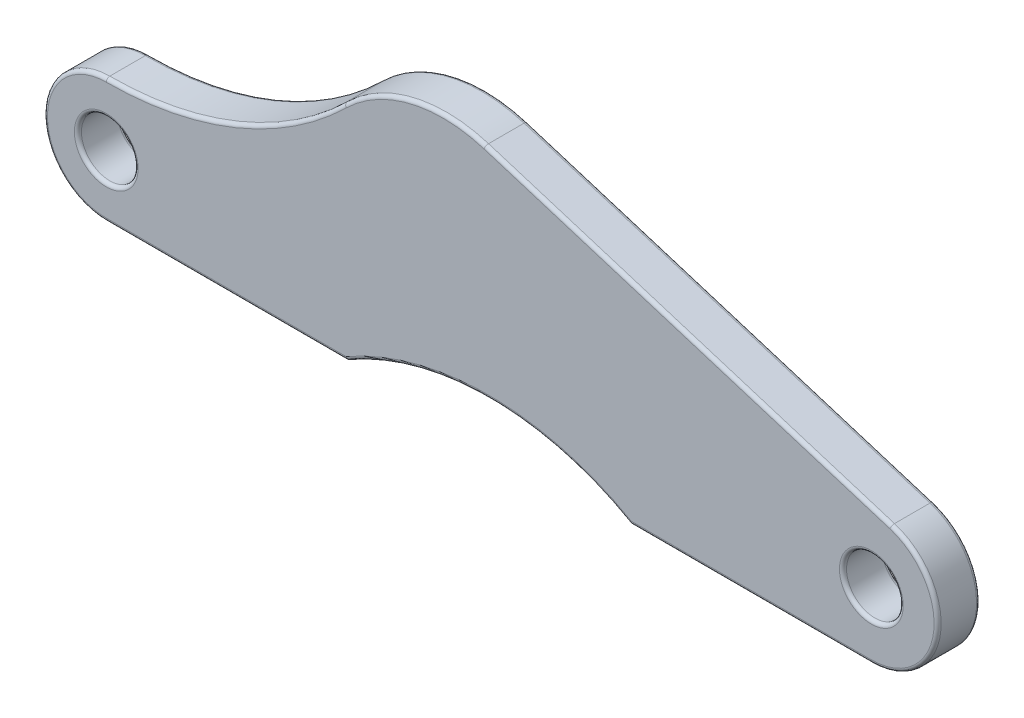
ISO-10303-21;
HEADER;
FILE_DESCRIPTION(('STEP AP214'),'2;1');
FILE_NAME('part.step','',(''),(''),'','','');
FILE_SCHEMA(('AUTOMOTIVE_DESIGN { 1 0 10303 214 1 1 1 1 }'));
ENDSEC;
DATA;
#1=APPLICATION_CONTEXT('core data for automotive mechanical design processes');
#2=APPLICATION_PROTOCOL_DEFINITION('international standard','automotive_design',2000,#1);
#3=PRODUCT_CONTEXT('',#1,'mechanical');
#4=PRODUCT('Part','Part','',(#3));
#5=PRODUCT_RELATED_PRODUCT_CATEGORY('part','',(#4));
#6=PRODUCT_DEFINITION_FORMATION('','',#4);
#7=PRODUCT_DEFINITION_CONTEXT('part definition',#1,'design');
#8=PRODUCT_DEFINITION('design','',#6,#7);
#9=PRODUCT_DEFINITION_SHAPE('','',#8);
#10=(LENGTH_UNIT() NAMED_UNIT(*) SI_UNIT(.MILLI.,.METRE.));
#11=(NAMED_UNIT(*) PLANE_ANGLE_UNIT() SI_UNIT($,.RADIAN.));
#12=(NAMED_UNIT(*) SI_UNIT($,.STERADIAN.) SOLID_ANGLE_UNIT());
#13=UNCERTAINTY_MEASURE_WITH_UNIT(LENGTH_MEASURE(1.E-05),#10,'distance_accuracy_value','');
#14=(GEOMETRIC_REPRESENTATION_CONTEXT(3) GLOBAL_UNCERTAINTY_ASSIGNED_CONTEXT((#13)) GLOBAL_UNIT_ASSIGNED_CONTEXT((#10,
#11,#12)) REPRESENTATION_CONTEXT('',''));
#15=CARTESIAN_POINT('',(0.,0.,0.));
#16=DIRECTION('',(0.,0.,1.));
#17=DIRECTION('',(1.,0.,0.));
#18=AXIS2_PLACEMENT_3D('',#15,#16,#17);
#19=CARTESIAN_POINT('',(-27.,4.4,1.5));
#20=DIRECTION('',(0.,0.,-1.));
#21=DIRECTION('',(-1.,0.,0.));
#22=AXIS2_PLACEMENT_3D('',#19,#20,#21);
#23=PLANE('',#22);
#24=CARTESIAN_POINT('',(27.,4.67759357368477,1.5));
#25=DIRECTION('',(0.,0.,-1.));
#26=DIRECTION('',(-1.,0.,0.));
#27=AXIS2_PLACEMENT_3D('',#24,#25,#26);
#28=CIRCLE('',#27,2.25);
#29=CARTESIAN_POINT('',(24.75,4.67759357368477,1.5));
#30=VERTEX_POINT('',#29);
#31=EDGE_CURVE('E176',#30,#30,#28,.T.);
#32=ORIENTED_EDGE('',*,*,#31,.T.);
#33=EDGE_LOOP('',(#32));
#34=FACE_BOUND('',#33,.T.);
#35=CARTESIAN_POINT('',(-27.,4.4,1.5));
#36=DIRECTION('',(0.,0.,-1.));
#37=DIRECTION('',(-1.,0.,0.));
#38=AXIS2_PLACEMENT_3D('',#35,#36,#37);
#39=CIRCLE('',#38,2.25);
#40=CARTESIAN_POINT('',(-29.25,4.4,1.5));
#41=VERTEX_POINT('',#40);
#42=EDGE_CURVE('E173',#41,#41,#39,.T.);
#43=ORIENTED_EDGE('',*,*,#42,.T.);
#44=EDGE_LOOP('',(#43));
#45=FACE_BOUND('',#44,.T.);
#46=CARTESIAN_POINT('',(-3.22891311803524,8.49083653331356,1.5));
#47=DIRECTION('',(0.,0.,-1.));
#48=DIRECTION('',(-1.,0.,0.));
#49=AXIS2_PLACEMENT_3D('',#46,#47,#48);
#50=CIRCLE('',#49,9.75);
#51=CARTESIAN_POINT('',(-0.33763276202348,17.8022809917711,1.5));
#52=VERTEX_POINT('',#51);
#53=CARTESIAN_POINT('',(-10.0456218562457,15.4618466450839,1.5));
#54=VERTEX_POINT('',#53);
#55=EDGE_CURVE('E171',#52,#54,#50,.F.);
#56=ORIENTED_EDGE('',*,*,#55,.T.);
#57=CARTESIAN_POINT('',(-27.,32.8,1.5));
#58=DIRECTION('',(0.,0.,-1.));
#59=DIRECTION('',(-1.,0.,0.));
#60=AXIS2_PLACEMENT_3D('',#57,#58,#59);
#61=CIRCLE('',#60,24.25);
#62=CARTESIAN_POINT('',(-27.,8.55,1.5));
#63=VERTEX_POINT('',#62);
#64=EDGE_CURVE('E153',#54,#63,#61,.T.);
#65=ORIENTED_EDGE('',*,*,#64,.T.);
#66=CARTESIAN_POINT('',(-27.,4.4,1.5));
#67=DIRECTION('',(0.,0.,-1.));
#68=DIRECTION('',(-1.,0.,0.));
#69=AXIS2_PLACEMENT_3D('',#66,#67,#68);
#70=CIRCLE('',#69,4.15);
#71=CARTESIAN_POINT('',(-27.,0.250000000000001,1.5));
#72=VERTEX_POINT('',#71);
#73=EDGE_CURVE('E161',#63,#72,#70,.F.);
#74=ORIENTED_EDGE('',*,*,#73,.T.);
#75=DIRECTION('',(1.,0.,0.));
#76=VECTOR('',#75,1.);
#77=CARTESIAN_POINT('',(-27.,0.25,1.5));
#78=LINE('',#77,#76);
#79=CARTESIAN_POINT('',(-10.0667644236942,0.25,1.5));
#80=VERTEX_POINT('',#79);
#81=EDGE_CURVE('E167',#72,#80,#78,.T.);
#82=ORIENTED_EDGE('',*,*,#81,.T.);
#83=CARTESIAN_POINT('',(0.,-17.3205080756888,1.5));
#84=DIRECTION('',(0.,0.,-1.));
#85=DIRECTION('',(-1.,0.,0.));
#86=AXIS2_PLACEMENT_3D('',#83,#84,#85);
#87=CIRCLE('',#86,20.25);
#88=CARTESIAN_POINT('',(10.0667644236942,0.25,1.5));
#89=VERTEX_POINT('',#88);
#90=EDGE_CURVE('E456',#80,#89,#87,.T.);
#91=ORIENTED_EDGE('',*,*,#90,.T.);
#92=DIRECTION('',(1.,0.,0.));
#93=VECTOR('',#92,1.);
#94=CARTESIAN_POINT('',(-27.,0.25,1.5));
#95=LINE('',#94,#93);
#96=CARTESIAN_POINT('',(27.,0.25,1.5));
#97=VERTEX_POINT('',#96);
#98=EDGE_CURVE('E458',#89,#97,#95,.T.);
#99=ORIENTED_EDGE('',*,*,#98,.T.);
#100=CARTESIAN_POINT('',(27.,4.67759357368477,1.5));
#101=DIRECTION('',(0.,0.,-1.));
#102=DIRECTION('',(-1.,0.,0.));
#103=AXIS2_PLACEMENT_3D('',#100,#101,#102);
#104=CIRCLE('',#103,4.42759357368476);
#105=CARTESIAN_POINT('',(28.3129655716922,8.9060337425042,1.5));
#106=VERTEX_POINT('',#105);
#107=EDGE_CURVE('E427',#97,#106,#104,.F.);
#108=ORIENTED_EDGE('',*,*,#107,.T.);
#109=DIRECTION('',(-0.955019944457189,0.296541574975565,0.));
#110=VECTOR('',#109,1.);
#111=CARTESIAN_POINT('',(-20.8598261553698,24.1745914195654,1.5));
#112=LINE('',#111,#110);
#113=EDGE_CURVE('E178',#106,#52,#112,.T.);
#114=ORIENTED_EDGE('',*,*,#113,.T.);
#115=EDGE_LOOP('',(#56,#65,#74,#82,#91,#99,#108,#114));
#116=FACE_BOUND('',#115,.T.);
#117=ADVANCED_FACE('F33',(#34,#45,#116),#23,.F.);
#118=CARTESIAN_POINT('',(-27.,4.4,-1.5));
#119=DIRECTION('',(0.,0.,-1.));
#120=DIRECTION('',(-1.,0.,0.));
#121=AXIS2_PLACEMENT_3D('',#118,#119,#120);
#122=PLANE('',#121);
#123=CARTESIAN_POINT('',(27.,4.67759357368477,-1.5));
#124=DIRECTION('',(0.,0.,-1.));
#125=DIRECTION('',(-1.,0.,0.));
#126=AXIS2_PLACEMENT_3D('',#123,#124,#125);
#127=CIRCLE('',#126,2.25);
#128=CARTESIAN_POINT('',(24.75,4.67759357368477,-1.5));
#129=VERTEX_POINT('',#128);
#130=EDGE_CURVE('E11',#129,#129,#127,.F.);
#131=ORIENTED_EDGE('',*,*,#130,.T.);
#132=EDGE_LOOP('',(#131));
#133=FACE_BOUND('',#132,.T.);
#134=CARTESIAN_POINT('',(0.,-17.3205080756888,-1.5));
#135=DIRECTION('',(0.,0.,-1.));
#136=DIRECTION('',(-1.,0.,0.));
#137=AXIS2_PLACEMENT_3D('',#134,#135,#136);
#138=CIRCLE('',#137,20.25);
#139=CARTESIAN_POINT('',(10.0667644236942,0.25,-1.5));
#140=VERTEX_POINT('',#139);
#141=CARTESIAN_POINT('',(-10.0667644236942,0.25,-1.5));
#142=VERTEX_POINT('',#141);
#143=EDGE_CURVE('E50',#140,#142,#138,.F.);
#144=ORIENTED_EDGE('',*,*,#143,.T.);
#145=DIRECTION('',(1.,0.,0.));
#146=VECTOR('',#145,1.);
#147=CARTESIAN_POINT('',(-27.,0.25,-1.5));
#148=LINE('',#147,#146);
#149=CARTESIAN_POINT('',(-27.,0.250000000000001,-1.5));
#150=VERTEX_POINT('',#149);
#151=EDGE_CURVE('E42',#142,#150,#148,.F.);
#152=ORIENTED_EDGE('',*,*,#151,.T.);
#153=CARTESIAN_POINT('',(-27.,4.4,-1.5));
#154=DIRECTION('',(0.,0.,-1.));
#155=DIRECTION('',(-1.,0.,0.));
#156=AXIS2_PLACEMENT_3D('',#153,#154,#155);
#157=CIRCLE('',#156,4.15);
#158=CARTESIAN_POINT('',(-27.,8.55,-1.5));
#159=VERTEX_POINT('',#158);
#160=EDGE_CURVE('E225',#150,#159,#157,.T.);
#161=ORIENTED_EDGE('',*,*,#160,.T.);
#162=CARTESIAN_POINT('',(-27.,32.8,-1.5));
#163=DIRECTION('',(0.,0.,-1.));
#164=DIRECTION('',(-1.,0.,0.));
#165=AXIS2_PLACEMENT_3D('',#162,#163,#164);
#166=CIRCLE('',#165,24.25);
#167=CARTESIAN_POINT('',(-10.0456218562457,15.4618466450839,-1.5));
#168=VERTEX_POINT('',#167);
#169=EDGE_CURVE('E227',#159,#168,#166,.F.);
#170=ORIENTED_EDGE('',*,*,#169,.T.);
#171=CARTESIAN_POINT('',(-3.22891311803524,8.49083653331356,-1.5));
#172=DIRECTION('',(0.,0.,-1.));
#173=DIRECTION('',(-1.,0.,0.));
#174=AXIS2_PLACEMENT_3D('',#171,#172,#173);
#175=CIRCLE('',#174,9.75);
#176=CARTESIAN_POINT('',(-0.337632762023481,17.8022809917711,-1.5));
#177=VERTEX_POINT('',#176);
#178=EDGE_CURVE('E229',#168,#177,#175,.T.);
#179=ORIENTED_EDGE('',*,*,#178,.T.);
#180=DIRECTION('',(-0.955019944457189,0.296541574975565,0.));
#181=VECTOR('',#180,1.);
#182=CARTESIAN_POINT('',(28.3129655716922,8.90603374250419,-1.5));
#183=LINE('',#182,#181);
#184=CARTESIAN_POINT('',(28.3129655716922,8.90603374250419,-1.5));
#185=VERTEX_POINT('',#184);
#186=EDGE_CURVE('E231',#177,#185,#183,.F.);
#187=ORIENTED_EDGE('',*,*,#186,.T.);
#188=CARTESIAN_POINT('',(27.,4.67759357368477,-1.5));
#189=DIRECTION('',(0.,0.,-1.));
#190=DIRECTION('',(-1.,0.,0.));
#191=AXIS2_PLACEMENT_3D('',#188,#189,#190);
#192=CIRCLE('',#191,4.42759357368476);
#193=CARTESIAN_POINT('',(27.,0.250000000000004,-1.5));
#194=VERTEX_POINT('',#193);
#195=EDGE_CURVE('E233',#185,#194,#192,.T.);
#196=ORIENTED_EDGE('',*,*,#195,.T.);
#197=DIRECTION('',(1.,0.,0.));
#198=VECTOR('',#197,1.);
#199=CARTESIAN_POINT('',(9.99999999999999,0.25,-1.5));
#200=LINE('',#199,#198);
#201=EDGE_CURVE('E55',#194,#140,#200,.F.);
#202=ORIENTED_EDGE('',*,*,#201,.T.);
#203=EDGE_LOOP('',(#144,#152,#161,#170,#179,#187,#196,#202));
#204=FACE_BOUND('',#203,.T.);
#205=CARTESIAN_POINT('',(-27.,4.4,-1.5));
#206=DIRECTION('',(0.,0.,-1.));
#207=DIRECTION('',(-1.,0.,0.));
#208=AXIS2_PLACEMENT_3D('',#205,#206,#207);
#209=CIRCLE('',#208,2.25);
#210=CARTESIAN_POINT('',(-29.25,4.4,-1.5));
#211=VERTEX_POINT('',#210);
#212=EDGE_CURVE('E222',#211,#211,#209,.F.);
#213=ORIENTED_EDGE('',*,*,#212,.T.);
#214=EDGE_LOOP('',(#213));
#215=FACE_BOUND('',#214,.T.);
#216=ADVANCED_FACE('F341',(#133,#204,#215),#122,.T.);
#217=CARTESIAN_POINT('',(-27.,4.4,1.5));
#218=DIRECTION('',(0.,0.,-1.));
#219=DIRECTION('',(-1.,0.,0.));
#220=AXIS2_PLACEMENT_3D('',#217,#218,#219);
#221=CYLINDRICAL_SURFACE('',#220,4.4);
#222=DIRECTION('',(0.,0.,-1.));
#223=VECTOR('',#222,1.);
#224=CARTESIAN_POINT('',(-27.,0.,1.5));
#225=LINE('',#224,#223);
#226=CARTESIAN_POINT('',(-27.,0.,1.25));
#227=VERTEX_POINT('',#226);
#228=CARTESIAN_POINT('',(-27.,0.,-1.25));
#229=VERTEX_POINT('',#228);
#230=EDGE_CURVE('E447',#227,#229,#225,.T.);
#231=ORIENTED_EDGE('',*,*,#230,.F.);
#232=CARTESIAN_POINT('',(-27.,4.4,1.25));
#233=DIRECTION('',(0.,0.,-1.));
#234=DIRECTION('',(-1.,0.,0.));
#235=AXIS2_PLACEMENT_3D('',#232,#233,#234);
#236=CIRCLE('',#235,4.4);
#237=CARTESIAN_POINT('',(-27.,8.8,1.25));
#238=VERTEX_POINT('',#237);
#239=EDGE_CURVE('E220',#227,#238,#236,.T.);
#240=ORIENTED_EDGE('',*,*,#239,.T.);
#241=DIRECTION('',(0.,0.,-1.));
#242=VECTOR('',#241,1.);
#243=CARTESIAN_POINT('',(-27.,8.8,1.5));
#244=LINE('',#243,#242);
#245=CARTESIAN_POINT('',(-27.,8.8,-1.25));
#246=VERTEX_POINT('',#245);
#247=EDGE_CURVE('E430',#238,#246,#244,.T.);
#248=ORIENTED_EDGE('',*,*,#247,.T.);
#249=CARTESIAN_POINT('',(-27.,4.4,-1.25));
#250=DIRECTION('',(0.,0.,-1.));
#251=DIRECTION('',(-1.,0.,0.));
#252=AXIS2_PLACEMENT_3D('',#249,#250,#251);
#253=CIRCLE('',#252,4.4);
#254=EDGE_CURVE('E218',#246,#229,#253,.F.);
#255=ORIENTED_EDGE('',*,*,#254,.T.);
#256=EDGE_LOOP('',(#231,#240,#248,#255));
#257=FACE_BOUND('',#256,.T.);
#258=ADVANCED_FACE('F347',(#257),#221,.T.);
#259=CARTESIAN_POINT('',(-27.,0.,1.5));
#260=DIRECTION('',(0.,1.,0.));
#261=DIRECTION('',(0.,0.,1.));
#262=AXIS2_PLACEMENT_3D('',#259,#260,#261);
#263=PLANE('',#262);
#264=DIRECTION('',(0.,0.,-1.));
#265=VECTOR('',#264,1.);
#266=CARTESIAN_POINT('',(-10.,0.,1.5));
#267=LINE('',#266,#265);
#268=CARTESIAN_POINT('',(-10.,0.,1.25));
#269=VERTEX_POINT('',#268);
#270=CARTESIAN_POINT('',(-10.,0.,-1.25));
#271=VERTEX_POINT('',#270);
#272=EDGE_CURVE('E444',#269,#271,#267,.T.);
#273=ORIENTED_EDGE('',*,*,#272,.F.);
#274=DIRECTION('',(1.,0.,0.));
#275=VECTOR('',#274,1.);
#276=CARTESIAN_POINT('',(-27.,0.,1.25));
#277=LINE('',#276,#275);
#278=EDGE_CURVE('E216',#269,#227,#277,.F.);
#279=ORIENTED_EDGE('',*,*,#278,.T.);
#280=ORIENTED_EDGE('',*,*,#230,.T.);
#281=DIRECTION('',(1.,0.,0.));
#282=VECTOR('',#281,1.);
#283=CARTESIAN_POINT('',(-10.,0.,-1.25));
#284=LINE('',#283,#282);
#285=EDGE_CURVE('E213',#229,#271,#284,.T.);
#286=ORIENTED_EDGE('',*,*,#285,.T.);
#287=EDGE_LOOP('',(#273,#279,#280,#286));
#288=FACE_BOUND('',#287,.T.);
#289=ADVANCED_FACE('F378',(#288),#263,.F.);
#290=CARTESIAN_POINT('',(0.,-17.3205080756888,1.5));
#291=DIRECTION('',(0.,0.,-1.));
#292=DIRECTION('',(-1.,0.,0.));
#293=AXIS2_PLACEMENT_3D('',#290,#291,#292);
#294=CYLINDRICAL_SURFACE('',#293,20.);
#295=DIRECTION('',(0.,0.,-1.));
#296=VECTOR('',#295,1.);
#297=CARTESIAN_POINT('',(9.99999999999999,0.,1.5));
#298=LINE('',#297,#296);
#299=CARTESIAN_POINT('',(9.99999999999999,0.,1.25));
#300=VERTEX_POINT('',#299);
#301=CARTESIAN_POINT('',(9.99999999999999,0.,-1.25));
#302=VERTEX_POINT('',#301);
#303=EDGE_CURVE('E441',#300,#302,#298,.T.);
#304=ORIENTED_EDGE('',*,*,#303,.F.);
#305=CARTESIAN_POINT('',(0.,-17.3205080756888,1.25));
#306=DIRECTION('',(0.,0.,-1.));
#307=DIRECTION('',(-1.,0.,0.));
#308=AXIS2_PLACEMENT_3D('',#305,#306,#307);
#309=CIRCLE('',#308,20.);
#310=EDGE_CURVE('E211',#300,#269,#309,.F.);
#311=ORIENTED_EDGE('',*,*,#310,.T.);
#312=ORIENTED_EDGE('',*,*,#272,.T.);
#313=CARTESIAN_POINT('',(0.,-17.3205080756888,-1.25));
#314=DIRECTION('',(0.,0.,-1.));
#315=DIRECTION('',(-1.,0.,0.));
#316=AXIS2_PLACEMENT_3D('',#313,#314,#315);
#317=CIRCLE('',#316,20.);
#318=EDGE_CURVE('E209',#271,#302,#317,.T.);
#319=ORIENTED_EDGE('',*,*,#318,.T.);
#320=EDGE_LOOP('',(#304,#311,#312,#319));
#321=FACE_BOUND('',#320,.T.);
#322=ADVANCED_FACE('F374',(#321),#294,.F.);
#323=CARTESIAN_POINT('',(10.,0.,1.5));
#324=DIRECTION('',(0.,1.,0.));
#325=DIRECTION('',(0.,0.,1.));
#326=AXIS2_PLACEMENT_3D('',#323,#324,#325);
#327=PLANE('',#326);
#328=DIRECTION('',(0.,0.,-1.));
#329=VECTOR('',#328,1.);
#330=CARTESIAN_POINT('',(27.,0.,1.5));
#331=LINE('',#330,#329);
#332=CARTESIAN_POINT('',(27.,0.,1.25));
#333=VERTEX_POINT('',#332);
#334=CARTESIAN_POINT('',(27.,0.,-1.25));
#335=VERTEX_POINT('',#334);
#336=EDGE_CURVE('E422',#333,#335,#331,.T.);
#337=ORIENTED_EDGE('',*,*,#336,.F.);
#338=DIRECTION('',(1.,0.,0.));
#339=VECTOR('',#338,1.);
#340=CARTESIAN_POINT('',(10.,0.,1.25));
#341=LINE('',#340,#339);
#342=EDGE_CURVE('E207',#333,#300,#341,.F.);
#343=ORIENTED_EDGE('',*,*,#342,.T.);
#344=ORIENTED_EDGE('',*,*,#303,.T.);
#345=DIRECTION('',(1.,0.,0.));
#346=VECTOR('',#345,1.);
#347=CARTESIAN_POINT('',(27.,0.,-1.25));
#348=LINE('',#347,#346);
#349=EDGE_CURVE('E205',#302,#335,#348,.T.);
#350=ORIENTED_EDGE('',*,*,#349,.T.);
#351=EDGE_LOOP('',(#337,#343,#344,#350));
#352=FACE_BOUND('',#351,.T.);
#353=ADVANCED_FACE('F370',(#352),#327,.F.);
#354=CARTESIAN_POINT('',(27.,4.67759357368477,1.5));
#355=DIRECTION('',(0.,0.,-1.));
#356=DIRECTION('',(-1.,0.,0.));
#357=AXIS2_PLACEMENT_3D('',#354,#355,#356);
#358=CYLINDRICAL_SURFACE('',#357,4.67759357368476);
#359=DIRECTION('',(0.,0.,-1.));
#360=VECTOR('',#359,1.);
#361=CARTESIAN_POINT('',(28.3871009654361,9.14478872861849,1.5));
#362=LINE('',#361,#360);
#363=CARTESIAN_POINT('',(28.3871009654361,9.14478872861849,1.25));
#364=VERTEX_POINT('',#363);
#365=CARTESIAN_POINT('',(28.3871009654361,9.14478872861849,-1.25));
#366=VERTEX_POINT('',#365);
#367=EDGE_CURVE('E414',#364,#366,#362,.T.);
#368=ORIENTED_EDGE('',*,*,#367,.F.);
#369=CARTESIAN_POINT('',(27.,4.67759357368477,1.25));
#370=DIRECTION('',(0.,0.,-1.));
#371=DIRECTION('',(-1.,0.,0.));
#372=AXIS2_PLACEMENT_3D('',#369,#370,#371);
#373=CIRCLE('',#372,4.67759357368476);
#374=EDGE_CURVE('E203',#364,#333,#373,.T.);
#375=ORIENTED_EDGE('',*,*,#374,.T.);
#376=ORIENTED_EDGE('',*,*,#336,.T.);
#377=CARTESIAN_POINT('',(27.,4.67759357368477,-1.25));
#378=DIRECTION('',(0.,0.,-1.));
#379=DIRECTION('',(-1.,0.,0.));
#380=AXIS2_PLACEMENT_3D('',#377,#378,#379);
#381=CIRCLE('',#380,4.67759357368476);
#382=EDGE_CURVE('E201',#335,#366,#381,.F.);
#383=ORIENTED_EDGE('',*,*,#382,.T.);
#384=EDGE_LOOP('',(#368,#375,#376,#383));
#385=FACE_BOUND('',#384,.T.);
#386=ADVANCED_FACE('F366',(#385),#358,.T.);
#387=CARTESIAN_POINT('',(28.3871009654361,9.14478872861849,1.5));
#388=DIRECTION('',(-0.296541574975565,-0.955019944457188,0.));
#389=DIRECTION('',(0.955019944457189,-0.296541574975565,0.));
#390=AXIS2_PLACEMENT_3D('',#387,#388,#389);
#391=PLANE('',#390);
#392=DIRECTION('',(0.,0.,-1.));
#393=VECTOR('',#392,1.);
#394=CARTESIAN_POINT('',(-0.263497368279591,18.0410359778854,1.5));
#395=LINE('',#394,#393);
#396=CARTESIAN_POINT('',(-0.263497368279591,18.0410359778854,1.25));
#397=VERTEX_POINT('',#396);
#398=CARTESIAN_POINT('',(-0.263497368279591,18.0410359778854,-1.25));
#399=VERTEX_POINT('',#398);
#400=EDGE_CURVE('E417',#397,#399,#395,.T.);
#401=ORIENTED_EDGE('',*,*,#400,.F.);
#402=DIRECTION('',(-0.955019944457189,0.296541574975565,0.));
#403=VECTOR('',#402,1.);
#404=CARTESIAN_POINT('',(28.3871009654361,9.14478872861849,1.25));
#405=LINE('',#404,#403);
#406=EDGE_CURVE('E199',#397,#364,#405,.F.);
#407=ORIENTED_EDGE('',*,*,#406,.T.);
#408=ORIENTED_EDGE('',*,*,#367,.T.);
#409=DIRECTION('',(-0.955019944457189,0.296541574975565,0.));
#410=VECTOR('',#409,1.);
#411=CARTESIAN_POINT('',(-0.263497368279603,18.0410359778854,-1.25));
#412=LINE('',#411,#410);
#413=EDGE_CURVE('E197',#366,#399,#412,.T.);
#414=ORIENTED_EDGE('',*,*,#413,.T.);
#415=EDGE_LOOP('',(#401,#407,#408,#414));
#416=FACE_BOUND('',#415,.T.);
#417=ADVANCED_FACE('F362',(#416),#391,.F.);
#418=CARTESIAN_POINT('',(-3.22891311803524,8.49083653331356,1.5));
#419=DIRECTION('',(0.,0.,-1.));
#420=DIRECTION('',(-1.,0.,0.));
#421=AXIS2_PLACEMENT_3D('',#418,#419,#420);
#422=CYLINDRICAL_SURFACE('',#421,10.);
#423=DIRECTION('',(0.,0.,-1.));
#424=VECTOR('',#423,1.);
#425=CARTESIAN_POINT('',(-10.2204092597896,15.6405904941037,1.5));
#426=LINE('',#425,#424);
#427=CARTESIAN_POINT('',(-10.2204092597896,15.6405904941037,1.25));
#428=VERTEX_POINT('',#427);
#429=CARTESIAN_POINT('',(-10.2204092597896,15.6405904941037,-1.25));
#430=VERTEX_POINT('',#429);
#431=EDGE_CURVE('E432',#428,#430,#426,.T.);
#432=ORIENTED_EDGE('',*,*,#431,.F.);
#433=CARTESIAN_POINT('',(-3.22891311803524,8.49083653331356,1.25));
#434=DIRECTION('',(0.,0.,-1.));
#435=DIRECTION('',(-1.,0.,0.));
#436=AXIS2_PLACEMENT_3D('',#433,#434,#435);
#437=CIRCLE('',#436,10.);
#438=EDGE_CURVE('E195',#428,#397,#437,.T.);
#439=ORIENTED_EDGE('',*,*,#438,.T.);
#440=ORIENTED_EDGE('',*,*,#400,.T.);
#441=CARTESIAN_POINT('',(-3.22891311803524,8.49083653331356,-1.25));
#442=DIRECTION('',(0.,0.,-1.));
#443=DIRECTION('',(-1.,0.,0.));
#444=AXIS2_PLACEMENT_3D('',#441,#442,#443);
#445=CIRCLE('',#444,10.);
#446=EDGE_CURVE('E193',#399,#430,#445,.F.);
#447=ORIENTED_EDGE('',*,*,#446,.T.);
#448=EDGE_LOOP('',(#432,#439,#440,#447));
#449=FACE_BOUND('',#448,.T.);
#450=ADVANCED_FACE('F358',(#449),#422,.T.);
#451=CARTESIAN_POINT('',(-27.,32.8,1.5));
#452=DIRECTION('',(0.,0.,-1.));
#453=DIRECTION('',(-1.,0.,0.));
#454=AXIS2_PLACEMENT_3D('',#451,#452,#453);
#455=CYLINDRICAL_SURFACE('',#454,24.);
#456=ORIENTED_EDGE('',*,*,#247,.F.);
#457=CARTESIAN_POINT('',(-27.,32.8,1.25));
#458=DIRECTION('',(0.,0.,-1.));
#459=DIRECTION('',(-1.,0.,0.));
#460=AXIS2_PLACEMENT_3D('',#457,#458,#459);
#461=CIRCLE('',#460,24.);
#462=EDGE_CURVE('E155',#238,#428,#461,.F.);
#463=ORIENTED_EDGE('',*,*,#462,.T.);
#464=ORIENTED_EDGE('',*,*,#431,.T.);
#465=CARTESIAN_POINT('',(-27.,32.8,-1.25));
#466=DIRECTION('',(0.,0.,-1.));
#467=DIRECTION('',(-1.,0.,0.));
#468=AXIS2_PLACEMENT_3D('',#465,#466,#467);
#469=CIRCLE('',#468,24.);
#470=EDGE_CURVE('E190',#430,#246,#469,.T.);
#471=ORIENTED_EDGE('',*,*,#470,.T.);
#472=EDGE_LOOP('',(#456,#463,#464,#471));
#473=FACE_BOUND('',#472,.T.);
#474=ADVANCED_FACE('F355',(#473),#455,.F.);
#475=CARTESIAN_POINT('',(-27.,4.4,1.5));
#476=DIRECTION('',(0.,0.,-1.));
#477=DIRECTION('',(-1.,0.,0.));
#478=AXIS2_PLACEMENT_3D('',#475,#476,#477);
#479=CYLINDRICAL_SURFACE('',#478,2.);
#480=CARTESIAN_POINT('',(-27.,4.4,1.25));
#481=DIRECTION('',(0.,0.,-1.));
#482=DIRECTION('',(-1.,0.,0.));
#483=AXIS2_PLACEMENT_3D('',#480,#481,#482);
#484=CIRCLE('',#483,2.);
#485=CARTESIAN_POINT('',(-29.,4.4,1.25));
#486=VERTEX_POINT('',#485);
#487=EDGE_CURVE('E187',#486,#486,#484,.F.);
#488=ORIENTED_EDGE('',*,*,#487,.T.);
#489=EDGE_LOOP('',(#488));
#490=FACE_BOUND('',#489,.T.);
#491=CARTESIAN_POINT('',(-27.,4.4,-1.25));
#492=DIRECTION('',(0.,0.,-1.));
#493=DIRECTION('',(-1.,0.,0.));
#494=AXIS2_PLACEMENT_3D('',#491,#492,#493);
#495=CIRCLE('',#494,2.);
#496=CARTESIAN_POINT('',(-29.,4.4,-1.25));
#497=VERTEX_POINT('',#496);
#498=EDGE_CURVE('E184',#497,#497,#495,.T.);
#499=ORIENTED_EDGE('',*,*,#498,.T.);
#500=EDGE_LOOP('',(#499));
#501=FACE_BOUND('',#500,.T.);
#502=ADVANCED_FACE('F352',(#490,#501),#479,.F.);
#503=CARTESIAN_POINT('',(27.,4.67759357368477,1.5));
#504=DIRECTION('',(0.,0.,-1.));
#505=DIRECTION('',(-1.,0.,0.));
#506=AXIS2_PLACEMENT_3D('',#503,#504,#505);
#507=CYLINDRICAL_SURFACE('',#506,2.);
#508=CARTESIAN_POINT('',(27.,4.67759357368477,1.25));
#509=DIRECTION('',(0.,0.,-1.));
#510=DIRECTION('',(-1.,0.,0.));
#511=AXIS2_PLACEMENT_3D('',#508,#509,#510);
#512=CIRCLE('',#511,2.);
#513=CARTESIAN_POINT('',(25.,4.67759357368477,1.25));
#514=VERTEX_POINT('',#513);
#515=EDGE_CURVE('E168',#514,#514,#512,.F.);
#516=ORIENTED_EDGE('',*,*,#515,.T.);
#517=EDGE_LOOP('',(#516));
#518=FACE_BOUND('',#517,.T.);
#519=CARTESIAN_POINT('',(27.,4.67759357368477,-1.25));
#520=DIRECTION('',(0.,0.,-1.));
#521=DIRECTION('',(-1.,0.,0.));
#522=AXIS2_PLACEMENT_3D('',#519,#520,#521);
#523=CIRCLE('',#522,2.);
#524=CARTESIAN_POINT('',(25.,4.67759357368477,-1.25));
#525=VERTEX_POINT('',#524);
#526=EDGE_CURVE('E450',#525,#525,#523,.T.);
#527=ORIENTED_EDGE('',*,*,#526,.T.);
#528=EDGE_LOOP('',(#527));
#529=FACE_BOUND('',#528,.T.);
#530=ADVANCED_FACE('F389',(#518,#529),#507,.F.);
#531=CARTESIAN_POINT('',(27.,4.67759357368477,1.25));
#532=DIRECTION('',(0.,0.,-1.));
#533=DIRECTION('',(-1.,0.,0.));
#534=AXIS2_PLACEMENT_3D('',#531,#532,#533);
#535=TOROIDAL_SURFACE('',#534,2.25,0.25);
#536=ORIENTED_EDGE('',*,*,#31,.F.);
#537=EDGE_LOOP('',(#536));
#538=FACE_BOUND('',#537,.T.);
#539=ORIENTED_EDGE('',*,*,#515,.F.);
#540=EDGE_LOOP('',(#539));
#541=FACE_BOUND('',#540,.T.);
#542=ADVANCED_FACE('F386',(#538,#541),#535,.T.);
#543=CARTESIAN_POINT('',(-27.,4.4,1.25));
#544=DIRECTION('',(0.,0.,-1.));
#545=DIRECTION('',(-1.,0.,0.));
#546=AXIS2_PLACEMENT_3D('',#543,#544,#545);
#547=TOROIDAL_SURFACE('',#546,2.25,0.25);
#548=ORIENTED_EDGE('',*,*,#42,.F.);
#549=EDGE_LOOP('',(#548));
#550=FACE_BOUND('',#549,.T.);
#551=ORIENTED_EDGE('',*,*,#487,.F.);
#552=EDGE_LOOP('',(#551));
#553=FACE_BOUND('',#552,.T.);
#554=ADVANCED_FACE('F279',(#550,#553),#547,.T.);
#555=CARTESIAN_POINT('',(-27.,0.25,1.25));
#556=DIRECTION('',(1.,0.,0.));
#557=DIRECTION('',(0.,0.,-1.));
#558=AXIS2_PLACEMENT_3D('',#555,#556,#557);
#559=CYLINDRICAL_SURFACE('',#558,0.25);
#560=CARTESIAN_POINT('',(9.99999999999999,0.,1.25));
#561=CARTESIAN_POINT('',(9.99999634727963,-1.34310494480014E-05,1.26371890403626));
#562=CARTESIAN_POINT('',(10.0003023453142,0.00112837030023382,1.27743140504026));
#563=CARTESIAN_POINT('',(10.0015058356566,0.0056201579043305,1.30444039895834));
#564=CARTESIAN_POINT('',(10.002402332683,0.00896642854428673,1.31773755250553));
#565=CARTESIAN_POINT('',(10.0047593493071,0.0177661179060569,1.34356315288459));
#566=CARTESIAN_POINT('',(10.0062199484249,0.0232198337088566,1.35609149104991));
#567=CARTESIAN_POINT('',(10.0096555804501,0.036051961565846,1.38004120375751));
#568=CARTESIAN_POINT('',(10.0116306346352,0.0434304532276388,1.39146253248773));
#569=CARTESIAN_POINT('',(10.0160657860079,0.0600055663907238,1.4130650521671));
#570=CARTESIAN_POINT('',(10.0185325591414,0.0692272172419123,1.42322564609766));
#571=CARTESIAN_POINT('',(10.0238580844695,0.0891444777525243,1.44186352282207));
#572=CARTESIAN_POINT('',(10.0267169793615,0.0998406240040729,1.45034019005455));
#573=CARTESIAN_POINT('',(10.0328425576612,0.122769564586718,1.46565871545545));
#574=CARTESIAN_POINT('',(10.036119454371,0.135040925918533,1.47243868665442));
#575=CARTESIAN_POINT('',(10.0429101251107,0.160484209364101,1.4838397698182));
#576=CARTESIAN_POINT('',(10.0464238074387,0.173655782873032,1.48846171210451));
#577=CARTESIAN_POINT('',(10.052560621576,0.196673197597813,1.49444729942718));
#578=CARTESIAN_POINT('',(10.0551499251896,0.206388603310293,1.49636536977126));
#579=CARTESIAN_POINT('',(10.0603632593145,0.225957416641286,1.49903642657357));
#580=CARTESIAN_POINT('',(10.0629872240383,0.23581056445228,1.49979136864908));
#581=CARTESIAN_POINT('',(10.0659953270923,0.24711061124992,1.49998750427625));
#582=CARTESIAN_POINT('',(10.066379911718,0.248555400321023,1.50000003299099));
#583=CARTESIAN_POINT('',(10.0667644236942,0.25,1.5));
#584=B_SPLINE_CURVE_WITH_KNOTS('',3,(#560,#561,#562,#563,#564,#565,#566,#567,#568,#569,#570,
#571,#572,#573,#574,#575,#576,#577,#578,#579,#580,#581,#582,#583),.UNSPECIFIED.,.F.,.F.,(4,2,2,
2,2,2,2,2,2,2,2,4),(0.,0.0410961687672679,0.0821232469013745,0.123156110625525,
0.164190671714051,0.205825808662849,0.24747613749098,0.290476331504832,0.333459967136423,
0.364107387312943,0.394703222220303,0.399188432401814),.UNSPECIFIED.);
#585=EDGE_CURVE('E266',#300,#89,#584,.T.);
#586=ORIENTED_EDGE('',*,*,#585,.F.);
#587=ORIENTED_EDGE('',*,*,#342,.F.);
#588=CARTESIAN_POINT('',(27.,0.25,1.25));
#589=DIRECTION('',(1.,0.,0.));
#590=DIRECTION('',(0.,0.,-1.));
#591=AXIS2_PLACEMENT_3D('',#588,#589,#590);
#592=CIRCLE('',#591,0.25);
#593=EDGE_CURVE('E273',#97,#333,#592,.T.);
#594=ORIENTED_EDGE('',*,*,#593,.F.);
#595=ORIENTED_EDGE('',*,*,#98,.F.);
#596=EDGE_LOOP('',(#586,#587,#594,#595));
#597=FACE_BOUND('',#596,.T.);
#598=ADVANCED_FACE('F275',(#597),#559,.T.);
#599=CARTESIAN_POINT('',(27.,4.67759357368477,1.25));
#600=DIRECTION('',(0.,0.,-1.));
#601=DIRECTION('',(-1.,0.,0.));
#602=AXIS2_PLACEMENT_3D('',#599,#600,#601);
#603=TOROIDAL_SURFACE('',#602,4.42759357368476,0.25);
#604=ORIENTED_EDGE('',*,*,#593,.T.);
#605=ORIENTED_EDGE('',*,*,#374,.F.);
#606=CARTESIAN_POINT('',(28.3129655716922,8.9060337425042,1.25));
#607=DIRECTION('',(-0.955019944457188,0.296541574975567,0.));
#608=DIRECTION('',(-0.296541574975567,-0.955019944457188,0.));
#609=AXIS2_PLACEMENT_3D('',#606,#607,#608);
#610=CIRCLE('',#609,0.25);
#611=EDGE_CURVE('E252',#106,#364,#610,.T.);
#612=ORIENTED_EDGE('',*,*,#611,.F.);
#613=ORIENTED_EDGE('',*,*,#107,.F.);
#614=EDGE_LOOP('',(#604,#605,#612,#613));
#615=FACE_BOUND('',#614,.T.);
#616=ADVANCED_FACE('F262',(#615),#603,.T.);
#617=CARTESIAN_POINT('',(0.,-17.3205080756888,1.25));
#618=DIRECTION('',(0.,0.,-1.));
#619=DIRECTION('',(-1.,0.,0.));
#620=AXIS2_PLACEMENT_3D('',#617,#618,#619);
#621=TOROIDAL_SURFACE('',#620,20.25,0.25);
#622=ORIENTED_EDGE('',*,*,#585,.T.);
#623=ORIENTED_EDGE('',*,*,#90,.F.);
#624=CARTESIAN_POINT('',(-10.,0.,1.25));
#625=CARTESIAN_POINT('',(-9.99999634727963,-1.34310494479242E-05,1.26371890403626));
#626=CARTESIAN_POINT('',(-10.0003023453142,0.0011283703002339,1.27743140504026));
#627=CARTESIAN_POINT('',(-10.0015058356566,0.00562015790433068,1.30444039895834));
#628=CARTESIAN_POINT('',(-10.002402332683,0.00896642854428696,1.31773755250553));
#629=CARTESIAN_POINT('',(-10.0047593493071,0.0177661179060571,1.34356315288459));
#630=CARTESIAN_POINT('',(-10.0062199484249,0.0232198337088568,1.35609149104991));
#631=CARTESIAN_POINT('',(-10.0096555804501,0.0360519615658462,1.38004120375751));
#632=CARTESIAN_POINT('',(-10.0116306346352,0.0434304532276388,1.39146253248773));
#633=CARTESIAN_POINT('',(-10.0160657860079,0.0600055663907245,1.41306505216711));
#634=CARTESIAN_POINT('',(-10.0185325591414,0.0692272172419137,1.42322564609766));
#635=CARTESIAN_POINT('',(-10.0238580844695,0.089144477752526,1.44186352282207));
#636=CARTESIAN_POINT('',(-10.0267169793615,0.099840624004074,1.45034019005455));
#637=CARTESIAN_POINT('',(-10.0328425576612,0.122769564586719,1.46565871545545));
#638=CARTESIAN_POINT('',(-10.036119454371,0.135040925918536,1.47243868665442));
#639=CARTESIAN_POINT('',(-10.0429101251107,0.160484209364102,1.4838397698182));
#640=CARTESIAN_POINT('',(-10.0464238074387,0.17365578287303,1.48846171210451));
#641=CARTESIAN_POINT('',(-10.052560621576,0.196673197597811,1.49444729942718));
#642=CARTESIAN_POINT('',(-10.0551499251896,0.206388603310293,1.49636536977126));
#643=CARTESIAN_POINT('',(-10.0603632593145,0.225957416641285,1.49903642657357));
#644=CARTESIAN_POINT('',(-10.0629872240383,0.235810564452277,1.49979136864908));
#645=CARTESIAN_POINT('',(-10.0659953270923,0.24711061124992,1.49998750427625));
#646=CARTESIAN_POINT('',(-10.066379911718,0.248555400321023,1.50000003299099));
#647=CARTESIAN_POINT('',(-10.0667644236942,0.25,1.5));
#648=B_SPLINE_CURVE_WITH_KNOTS('',3,(#624,#625,#626,#627,#628,#629,#630,#631,#632,#633,#634,
#635,#636,#637,#638,#639,#640,#641,#642,#643,#644,#645,#646,#647),.UNSPECIFIED.,.F.,.F.,(4,2,2,
2,2,2,2,2,2,2,2,4),(0.,0.0410961687672683,0.0821232469013748,0.123156110625526,
0.164190671714052,0.205825808662851,0.247476137490982,0.290476331504833,0.333459967136425,
0.364107387312943,0.394703222220302,0.399188432401814),.UNSPECIFIED.);
#649=EDGE_CURVE('E243',#269,#80,#648,.T.);
#650=ORIENTED_EDGE('',*,*,#649,.F.);
#651=ORIENTED_EDGE('',*,*,#310,.F.);
#652=EDGE_LOOP('',(#622,#623,#650,#651));
#653=FACE_BOUND('',#652,.T.);
#654=ADVANCED_FACE('F257',(#653),#621,.T.);
#655=CARTESIAN_POINT('',(-20.8598261553698,24.1745914195654,1.25));
#656=DIRECTION('',(-0.955019944457189,0.296541574975565,0.));
#657=DIRECTION('',(-0.296541574975565,-0.955019944457189,0.));
#658=AXIS2_PLACEMENT_3D('',#655,#656,#657);
#659=CYLINDRICAL_SURFACE('',#658,0.25);
#660=ORIENTED_EDGE('',*,*,#611,.T.);
#661=ORIENTED_EDGE('',*,*,#406,.F.);
#662=CARTESIAN_POINT('',(-0.33763276202348,17.8022809917711,1.25));
#663=DIRECTION('',(-0.95501994445719,0.296541574975561,0.));
#664=DIRECTION('',(-0.296541574975561,-0.95501994445719,0.));
#665=AXIS2_PLACEMENT_3D('',#662,#663,#664);
#666=CIRCLE('',#665,0.25);
#667=EDGE_CURVE('E240',#52,#397,#666,.T.);
#668=ORIENTED_EDGE('',*,*,#667,.F.);
#669=ORIENTED_EDGE('',*,*,#113,.F.);
#670=EDGE_LOOP('',(#660,#661,#668,#669));
#671=FACE_BOUND('',#670,.T.);
#672=ADVANCED_FACE('F261',(#671),#659,.T.);
#673=CARTESIAN_POINT('',(-27.,0.25,1.25));
#674=DIRECTION('',(1.,0.,0.));
#675=DIRECTION('',(0.,0.,-1.));
#676=AXIS2_PLACEMENT_3D('',#673,#674,#675);
#677=CYLINDRICAL_SURFACE('',#676,0.25);
#678=ORIENTED_EDGE('',*,*,#649,.T.);
#679=ORIENTED_EDGE('',*,*,#81,.F.);
#680=CARTESIAN_POINT('',(-27.,0.25,1.25));
#681=DIRECTION('',(-1.,0.,0.));
#682=DIRECTION('',(0.,0.,1.));
#683=AXIS2_PLACEMENT_3D('',#680,#681,#682);
#684=CIRCLE('',#683,0.25);
#685=EDGE_CURVE('E164',#227,#72,#684,.T.);
#686=ORIENTED_EDGE('',*,*,#685,.F.);
#687=ORIENTED_EDGE('',*,*,#278,.F.);
#688=EDGE_LOOP('',(#678,#679,#686,#687));
#689=FACE_BOUND('',#688,.T.);
#690=ADVANCED_FACE('F254',(#689),#677,.T.);
#691=CARTESIAN_POINT('',(-3.22891311803524,8.49083653331356,1.25));
#692=DIRECTION('',(0.,0.,-1.));
#693=DIRECTION('',(-1.,0.,0.));
#694=AXIS2_PLACEMENT_3D('',#691,#692,#693);
#695=TOROIDAL_SURFACE('',#694,9.75,0.25);
#696=ORIENTED_EDGE('',*,*,#667,.T.);
#697=ORIENTED_EDGE('',*,*,#438,.F.);
#698=CARTESIAN_POINT('',(-10.0456218562457,15.4618466450839,1.25));
#699=DIRECTION('',(-0.71497539607901,-0.699149614175437,0.));
#700=DIRECTION('',(0.699149614175437,-0.714975396079011,0.));
#701=AXIS2_PLACEMENT_3D('',#698,#699,#700);
#702=CIRCLE('',#701,0.25);
#703=EDGE_CURVE('E158',#54,#428,#702,.T.);
#704=ORIENTED_EDGE('',*,*,#703,.F.);
#705=ORIENTED_EDGE('',*,*,#55,.F.);
#706=EDGE_LOOP('',(#696,#697,#704,#705));
#707=FACE_BOUND('',#706,.T.);
#708=ADVANCED_FACE('F397',(#707),#695,.T.);
#709=CARTESIAN_POINT('',(-27.,4.4,1.25));
#710=DIRECTION('',(0.,0.,-1.));
#711=DIRECTION('',(-1.,0.,0.));
#712=AXIS2_PLACEMENT_3D('',#709,#710,#711);
#713=TOROIDAL_SURFACE('',#712,4.15,0.25);
#714=ORIENTED_EDGE('',*,*,#685,.T.);
#715=ORIENTED_EDGE('',*,*,#73,.F.);
#716=CARTESIAN_POINT('',(-27.,8.55,1.25));
#717=DIRECTION('',(1.,0.,0.));
#718=DIRECTION('',(0.,0.,-1.));
#719=AXIS2_PLACEMENT_3D('',#716,#717,#718);
#720=CIRCLE('',#719,0.25);
#721=EDGE_CURVE('E149',#238,#63,#720,.T.);
#722=ORIENTED_EDGE('',*,*,#721,.F.);
#723=ORIENTED_EDGE('',*,*,#239,.F.);
#724=EDGE_LOOP('',(#714,#715,#722,#723));
#725=FACE_BOUND('',#724,.T.);
#726=ADVANCED_FACE('F162',(#725),#713,.T.);
#727=CARTESIAN_POINT('',(-27.,32.8,1.25));
#728=DIRECTION('',(0.,0.,-1.));
#729=DIRECTION('',(-1.,0.,0.));
#730=AXIS2_PLACEMENT_3D('',#727,#728,#729);
#731=TOROIDAL_SURFACE('',#730,24.25,0.25);
#732=ORIENTED_EDGE('',*,*,#703,.T.);
#733=ORIENTED_EDGE('',*,*,#462,.F.);
#734=ORIENTED_EDGE('',*,*,#721,.T.);
#735=ORIENTED_EDGE('',*,*,#64,.F.);
#736=EDGE_LOOP('',(#732,#733,#734,#735));
#737=FACE_BOUND('',#736,.T.);
#738=ADVANCED_FACE('F151',(#737),#731,.T.);
#739=CARTESIAN_POINT('',(27.,4.67759357368477,-1.25));
#740=DIRECTION('',(0.,0.,-1.));
#741=DIRECTION('',(-1.,0.,0.));
#742=AXIS2_PLACEMENT_3D('',#739,#740,#741);
#743=TOROIDAL_SURFACE('',#742,2.25,0.25);
#744=ORIENTED_EDGE('',*,*,#526,.F.);
#745=EDGE_LOOP('',(#744));
#746=FACE_BOUND('',#745,.T.);
#747=ORIENTED_EDGE('',*,*,#130,.F.);
#748=EDGE_LOOP('',(#747));
#749=FACE_BOUND('',#748,.T.);
#750=ADVANCED_FACE('F284',(#746,#749),#743,.T.);
#751=CARTESIAN_POINT('',(28.3129655716922,8.90603374250419,-1.25));
#752=DIRECTION('',(0.955019944457189,-0.296541574975565,0.));
#753=DIRECTION('',(0.296541574975565,0.955019944457189,0.));
#754=AXIS2_PLACEMENT_3D('',#751,#752,#753);
#755=CYLINDRICAL_SURFACE('',#754,0.25);
#756=CARTESIAN_POINT('',(28.3129655716922,8.90603374250419,-1.25));
#757=DIRECTION('',(0.955019944457189,-0.296541574975565,0.));
#758=DIRECTION('',(0.296541574975565,0.955019944457189,0.));
#759=AXIS2_PLACEMENT_3D('',#756,#757,#758);
#760=CIRCLE('',#759,0.25);
#761=EDGE_CURVE('E481',#185,#366,#760,.T.);
#762=ORIENTED_EDGE('',*,*,#761,.F.);
#763=ORIENTED_EDGE('',*,*,#186,.F.);
#764=CARTESIAN_POINT('',(-0.337632762023482,17.8022809917711,-1.25));
#765=DIRECTION('',(-0.955019944457189,0.296541574975563,0.));
#766=DIRECTION('',(-0.296541574975563,-0.955019944457189,0.));
#767=AXIS2_PLACEMENT_3D('',#764,#765,#766);
#768=CIRCLE('',#767,0.25);
#769=EDGE_CURVE('E37',#399,#177,#768,.T.);
#770=ORIENTED_EDGE('',*,*,#769,.F.);
#771=ORIENTED_EDGE('',*,*,#413,.F.);
#772=EDGE_LOOP('',(#762,#763,#770,#771));
#773=FACE_BOUND('',#772,.T.);
#774=ADVANCED_FACE('F287',(#773),#755,.T.);
#775=CARTESIAN_POINT('',(-3.22891311803524,8.49083653331356,-1.25));
#776=DIRECTION('',(0.,0.,-1.));
#777=DIRECTION('',(-1.,0.,0.));
#778=AXIS2_PLACEMENT_3D('',#775,#776,#777);
#779=TOROIDAL_SURFACE('',#778,9.75,0.25);
#780=ORIENTED_EDGE('',*,*,#769,.T.);
#781=ORIENTED_EDGE('',*,*,#178,.F.);
#782=CARTESIAN_POINT('',(-10.0456218562457,15.4618466450839,-1.25));
#783=DIRECTION('',(-0.714975396079014,-0.699149614175433,0.));
#784=DIRECTION('',(0.699149614175433,-0.714975396079014,0.));
#785=AXIS2_PLACEMENT_3D('',#782,#783,#784);
#786=CIRCLE('',#785,0.25);
#787=EDGE_CURVE('E479',#430,#168,#786,.T.);
#788=ORIENTED_EDGE('',*,*,#787,.F.);
#789=ORIENTED_EDGE('',*,*,#446,.F.);
#790=EDGE_LOOP('',(#780,#781,#788,#789));
#791=FACE_BOUND('',#790,.T.);
#792=ADVANCED_FACE('F331',(#791),#779,.T.);
#793=CARTESIAN_POINT('',(27.,4.67759357368477,-1.25));
#794=DIRECTION('',(0.,0.,-1.));
#795=DIRECTION('',(-1.,0.,0.));
#796=AXIS2_PLACEMENT_3D('',#793,#794,#795);
#797=TOROIDAL_SURFACE('',#796,4.42759357368476,0.25);
#798=ORIENTED_EDGE('',*,*,#761,.T.);
#799=ORIENTED_EDGE('',*,*,#382,.F.);
#800=CARTESIAN_POINT('',(27.,0.250000000000004,-1.25));
#801=DIRECTION('',(-1.,0.,0.));
#802=DIRECTION('',(0.,0.,1.));
#803=AXIS2_PLACEMENT_3D('',#800,#801,#802);
#804=CIRCLE('',#803,0.25);
#805=EDGE_CURVE('E477',#194,#335,#804,.T.);
#806=ORIENTED_EDGE('',*,*,#805,.F.);
#807=ORIENTED_EDGE('',*,*,#195,.F.);
#808=EDGE_LOOP('',(#798,#799,#806,#807));
#809=FACE_BOUND('',#808,.T.);
#810=ADVANCED_FACE('F327',(#809),#797,.T.);
#811=CARTESIAN_POINT('',(-27.,32.8,-1.25));
#812=DIRECTION('',(0.,0.,-1.));
#813=DIRECTION('',(-1.,0.,0.));
#814=AXIS2_PLACEMENT_3D('',#811,#812,#813);
#815=TOROIDAL_SURFACE('',#814,24.25,0.25);
#816=ORIENTED_EDGE('',*,*,#787,.T.);
#817=ORIENTED_EDGE('',*,*,#169,.F.);
#818=CARTESIAN_POINT('',(-27.,8.55,-1.25));
#819=DIRECTION('',(-1.,0.,0.));
#820=DIRECTION('',(0.,0.,1.));
#821=AXIS2_PLACEMENT_3D('',#818,#819,#820);
#822=CIRCLE('',#821,0.25);
#823=EDGE_CURVE('E313',#246,#159,#822,.T.);
#824=ORIENTED_EDGE('',*,*,#823,.F.);
#825=ORIENTED_EDGE('',*,*,#470,.F.);
#826=EDGE_LOOP('',(#816,#817,#824,#825));
#827=FACE_BOUND('',#826,.T.);
#828=ADVANCED_FACE('F320',(#827),#815,.T.);
#829=CARTESIAN_POINT('',(10.,0.25,-1.25));
#830=DIRECTION('',(-1.,0.,0.));
#831=DIRECTION('',(0.,0.,1.));
#832=AXIS2_PLACEMENT_3D('',#829,#830,#831);
#833=CYLINDRICAL_SURFACE('',#832,0.25);
#834=ORIENTED_EDGE('',*,*,#805,.T.);
#835=ORIENTED_EDGE('',*,*,#349,.F.);
#836=CARTESIAN_POINT('',(9.99999999999999,0.,-1.25));
#837=CARTESIAN_POINT('',(9.99999634727962,-1.34310494480837E-05,-1.26371890403626));
#838=CARTESIAN_POINT('',(10.0003023453142,0.00112837030023371,-1.27743140504026));
#839=CARTESIAN_POINT('',(10.0015058356566,0.00562015790433038,-1.30444039895834));
#840=CARTESIAN_POINT('',(10.002402332683,0.00896642854428657,-1.31773755250553));
#841=CARTESIAN_POINT('',(10.0047593493071,0.0177661179060566,-1.34356315288459));
#842=CARTESIAN_POINT('',(10.0062199484249,0.0232198337088564,-1.35609149104991));
#843=CARTESIAN_POINT('',(10.0096555804501,0.036051961565846,-1.38004120375751));
#844=CARTESIAN_POINT('',(10.0116306346352,0.043430453227639,-1.39146253248773));
#845=CARTESIAN_POINT('',(10.0160657860079,0.0600055663907235,-1.4130650521671));
#846=CARTESIAN_POINT('',(10.0185325591414,0.0692272172419114,-1.42322564609766));
#847=CARTESIAN_POINT('',(10.0238580844695,0.0891444777525239,-1.44186352282207));
#848=CARTESIAN_POINT('',(10.0267169793615,0.0998406240040736,-1.45034019005455));
#849=CARTESIAN_POINT('',(10.0328425576612,0.122769564586719,-1.46565871545545));
#850=CARTESIAN_POINT('',(10.036119454371,0.135040925918534,-1.47243868665442));
#851=CARTESIAN_POINT('',(10.0429101251107,0.160484209364102,-1.4838397698182));
#852=CARTESIAN_POINT('',(10.0464238074387,0.173655782873033,-1.48846171210451));
#853=CARTESIAN_POINT('',(10.052560621576,0.196673197597814,-1.49444729942718));
#854=CARTESIAN_POINT('',(10.0551499251896,0.206388603310293,-1.49636536977126));
#855=CARTESIAN_POINT('',(10.0603632593145,0.225957416641286,-1.49903642657357));
#856=CARTESIAN_POINT('',(10.0629872240383,0.235810564452281,-1.49979136864908));
#857=CARTESIAN_POINT('',(10.0659953270923,0.24711061124992,-1.49998750427625));
#858=CARTESIAN_POINT('',(10.066379911718,0.248555400321023,-1.50000003299099));
#859=CARTESIAN_POINT('',(10.0667644236942,0.25,-1.5));
#860=B_SPLINE_CURVE_WITH_KNOTS('',3,(#836,#837,#838,#839,#840,#841,#842,#843,#844,#845,#846,
#847,#848,#849,#850,#851,#852,#853,#854,#855,#856,#857,#858,#859),.UNSPECIFIED.,.F.,.F.,(4,2,2,
2,2,2,2,2,2,2,2,4),(0.,0.0410961687672684,0.0821232469013748,0.123156110625526,
0.164190671714051,0.205825808662849,0.247476137490981,0.290476331504833,0.333459967136426,
0.364107387312945,0.394703222220304,0.399188432401814),.UNSPECIFIED.);
#861=EDGE_CURVE('E306',#140,#302,#860,.F.);
#862=ORIENTED_EDGE('',*,*,#861,.F.);
#863=ORIENTED_EDGE('',*,*,#201,.F.);
#864=EDGE_LOOP('',(#834,#835,#862,#863));
#865=FACE_BOUND('',#864,.T.);
#866=ADVANCED_FACE('F316',(#865),#833,.T.);
#867=CARTESIAN_POINT('',(-27.,4.4,-1.25));
#868=DIRECTION('',(0.,0.,-1.));
#869=DIRECTION('',(-1.,0.,0.));
#870=AXIS2_PLACEMENT_3D('',#867,#868,#869);
#871=TOROIDAL_SURFACE('',#870,4.15,0.25);
#872=ORIENTED_EDGE('',*,*,#823,.T.);
#873=ORIENTED_EDGE('',*,*,#160,.F.);
#874=CARTESIAN_POINT('',(-27.,0.250000000000001,-1.25));
#875=DIRECTION('',(1.,0.,0.));
#876=DIRECTION('',(0.,0.,-1.));
#877=AXIS2_PLACEMENT_3D('',#874,#875,#876);
#878=CIRCLE('',#877,0.25);
#879=EDGE_CURVE('E314',#229,#150,#878,.T.);
#880=ORIENTED_EDGE('',*,*,#879,.F.);
#881=ORIENTED_EDGE('',*,*,#254,.F.);
#882=EDGE_LOOP('',(#872,#873,#880,#881));
#883=FACE_BOUND('',#882,.T.);
#884=ADVANCED_FACE('F294',(#883),#871,.T.);
#885=CARTESIAN_POINT('',(0.,-17.3205080756888,-1.25));
#886=DIRECTION('',(0.,0.,-1.));
#887=DIRECTION('',(-1.,0.,0.));
#888=AXIS2_PLACEMENT_3D('',#885,#886,#887);
#889=TOROIDAL_SURFACE('',#888,20.25,0.25);
#890=ORIENTED_EDGE('',*,*,#861,.T.);
#891=ORIENTED_EDGE('',*,*,#318,.F.);
#892=CARTESIAN_POINT('',(-10.,0.,-1.25));
#893=CARTESIAN_POINT('',(-9.99999634727963,-1.34310494481455E-05,-1.26371890403626));
#894=CARTESIAN_POINT('',(-10.0003023453142,0.00112837030023366,-1.27743140504026));
#895=CARTESIAN_POINT('',(-10.0015058356566,0.00562015790433046,-1.30444039895834));
#896=CARTESIAN_POINT('',(-10.002402332683,0.0089664285442868,-1.31773755250553));
#897=CARTESIAN_POINT('',(-10.0047593493071,0.0177661179060567,-1.34356315288459));
#898=CARTESIAN_POINT('',(-10.0062199484249,0.0232198337088561,-1.35609149104991));
#899=CARTESIAN_POINT('',(-10.0096555804501,0.0360519615658453,-1.38004120375751));
#900=CARTESIAN_POINT('',(-10.0116306346352,0.0434304532276383,-1.39146253248773));
#901=CARTESIAN_POINT('',(-10.0160657860079,0.0600055663907242,-1.41306505216711));
#902=CARTESIAN_POINT('',(-10.0185325591414,0.0692272172419135,-1.42322564609766));
#903=CARTESIAN_POINT('',(-10.0238580844695,0.0891444777525258,-1.44186352282207));
#904=CARTESIAN_POINT('',(-10.0267169793615,0.0998406240040739,-1.45034019005455));
#905=CARTESIAN_POINT('',(-10.0328425576612,0.122769564586719,-1.46565871545545));
#906=CARTESIAN_POINT('',(-10.036119454371,0.135040925918535,-1.47243868665442));
#907=CARTESIAN_POINT('',(-10.0429101251107,0.160484209364101,-1.4838397698182));
#908=CARTESIAN_POINT('',(-10.0464238074387,0.17365578287303,-1.48846171210451));
#909=CARTESIAN_POINT('',(-10.052560621576,0.196673197597811,-1.49444729942718));
#910=CARTESIAN_POINT('',(-10.0551499251896,0.206388603310292,-1.49636536977126));
#911=CARTESIAN_POINT('',(-10.0603632593145,0.225957416641285,-1.49903642657357));
#912=CARTESIAN_POINT('',(-10.0629872240383,0.235810564452277,-1.49979136864908));
#913=CARTESIAN_POINT('',(-10.0659953270923,0.247110611249919,-1.49998750427625));
#914=CARTESIAN_POINT('',(-10.066379911718,0.248555400321023,-1.50000003299099));
#915=CARTESIAN_POINT('',(-10.0667644236942,0.25,-1.5));
#916=B_SPLINE_CURVE_WITH_KNOTS('',3,(#892,#893,#894,#895,#896,#897,#898,#899,#900,#901,#902,
#903,#904,#905,#906,#907,#908,#909,#910,#911,#912,#913,#914,#915),.UNSPECIFIED.,.F.,.F.,(4,2,2,
2,2,2,2,2,2,2,2,4),(0.,0.0410961687672683,0.0821232469013747,0.123156110625525,
0.164190671714052,0.20582580866285,0.247476137490982,0.290476331504833,0.333459967136425,
0.364107387312943,0.394703222220302,0.399188432401813),.UNSPECIFIED.);
#917=EDGE_CURVE('E299',#142,#271,#916,.F.);
#918=ORIENTED_EDGE('',*,*,#917,.F.);
#919=ORIENTED_EDGE('',*,*,#143,.F.);
#920=EDGE_LOOP('',(#890,#891,#918,#919));
#921=FACE_BOUND('',#920,.T.);
#922=ADVANCED_FACE('F289',(#921),#889,.T.);
#923=CARTESIAN_POINT('',(-27.,0.25,-1.25));
#924=DIRECTION('',(-1.,0.,0.));
#925=DIRECTION('',(0.,0.,1.));
#926=AXIS2_PLACEMENT_3D('',#923,#924,#925);
#927=CYLINDRICAL_SURFACE('',#926,0.25);
#928=ORIENTED_EDGE('',*,*,#879,.T.);
#929=ORIENTED_EDGE('',*,*,#151,.F.);
#930=ORIENTED_EDGE('',*,*,#917,.T.);
#931=ORIENTED_EDGE('',*,*,#285,.F.);
#932=EDGE_LOOP('',(#928,#929,#930,#931));
#933=FACE_BOUND('',#932,.T.);
#934=ADVANCED_FACE('F293',(#933),#927,.T.);
#935=CARTESIAN_POINT('',(-27.,4.4,-1.25));
#936=DIRECTION('',(0.,0.,-1.));
#937=DIRECTION('',(-1.,0.,0.));
#938=AXIS2_PLACEMENT_3D('',#935,#936,#937);
#939=TOROIDAL_SURFACE('',#938,2.25,0.25);
#940=ORIENTED_EDGE('',*,*,#498,.F.);
#941=EDGE_LOOP('',(#940));
#942=FACE_BOUND('',#941,.T.);
#943=ORIENTED_EDGE('',*,*,#212,.F.);
#944=EDGE_LOOP('',(#943));
#945=FACE_BOUND('',#944,.T.);
#946=ADVANCED_FACE('F35',(#942,#945),#939,.T.);
#947=CLOSED_SHELL('',(#117,#216,#258,#289,#322,#353,#386,#417,#450,#474,#502,#530,#542,#554,
#598,#616,#654,#672,#690,#708,#726,#738,#750,#774,#792,#810,#828,#866,#884,#922,#934,#946));
#948=MANIFOLD_SOLID_BREP('B2',#947);
#949=ADVANCED_BREP_SHAPE_REPRESENTATION('',(#18,#948),#14);
#950=SHAPE_DEFINITION_REPRESENTATION(#9,#949);
ENDSEC;
END-ISO-10303-21;
